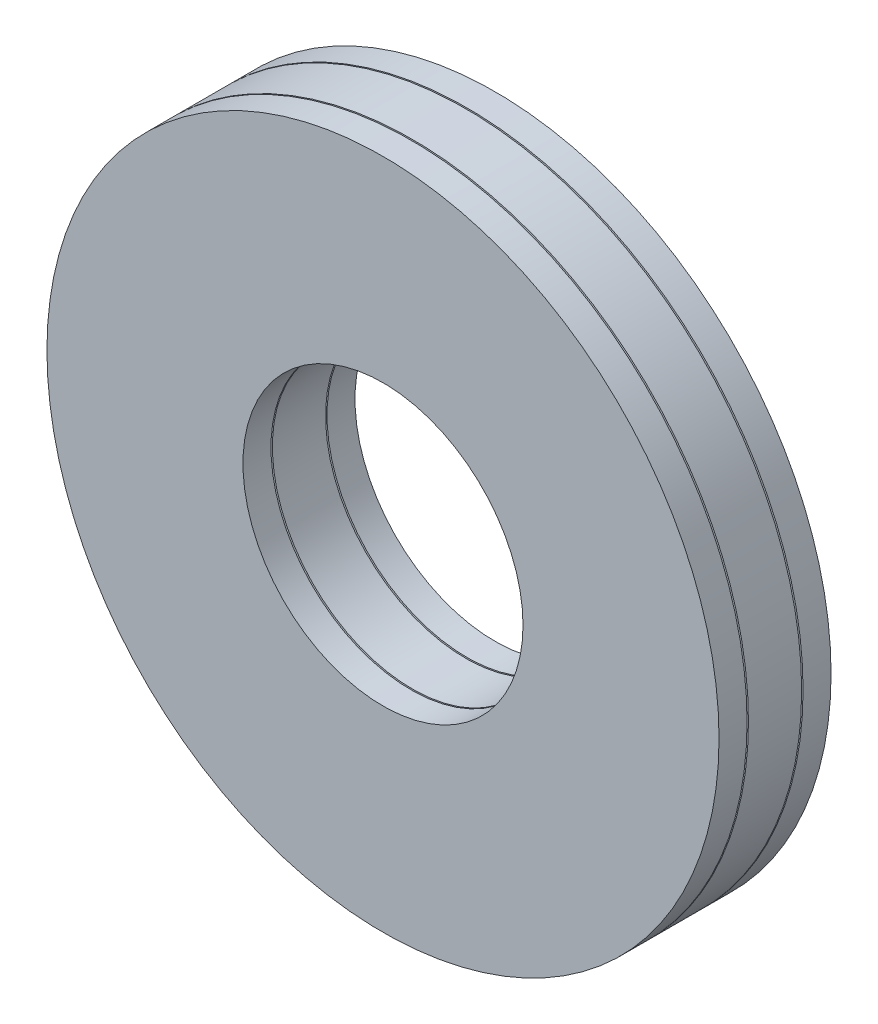
ISO-10303-21;
HEADER;
FILE_DESCRIPTION(('STEP AP214'),'2;1');
FILE_NAME('part.step','',(''),(''),'','','');
FILE_SCHEMA(('AUTOMOTIVE_DESIGN { 1 0 10303 214 1 1 1 1 }'));
ENDSEC;
DATA;
#1=APPLICATION_CONTEXT('core data for automotive mechanical design processes');
#2=APPLICATION_PROTOCOL_DEFINITION('international standard','automotive_design',2000,#1);
#3=PRODUCT_CONTEXT('',#1,'mechanical');
#4=PRODUCT('Part','Part','',(#3));
#5=PRODUCT_RELATED_PRODUCT_CATEGORY('part','',(#4));
#6=PRODUCT_DEFINITION_FORMATION('','',#4);
#7=PRODUCT_DEFINITION_CONTEXT('part definition',#1,'design');
#8=PRODUCT_DEFINITION('design','',#6,#7);
#9=PRODUCT_DEFINITION_SHAPE('','',#8);
#10=(LENGTH_UNIT() NAMED_UNIT(*) SI_UNIT(.MILLI.,.METRE.));
#11=(NAMED_UNIT(*) PLANE_ANGLE_UNIT() SI_UNIT($,.RADIAN.));
#12=(NAMED_UNIT(*) SI_UNIT($,.STERADIAN.) SOLID_ANGLE_UNIT());
#13=UNCERTAINTY_MEASURE_WITH_UNIT(LENGTH_MEASURE(1.E-05),#10,'distance_accuracy_value','');
#14=(GEOMETRIC_REPRESENTATION_CONTEXT(3) GLOBAL_UNCERTAINTY_ASSIGNED_CONTEXT((#13)) GLOBAL_UNIT_ASSIGNED_CONTEXT((#10,
#11,#12)) REPRESENTATION_CONTEXT('',''));
#15=CARTESIAN_POINT('',(0.,0.,0.));
#16=DIRECTION('',(0.,0.,1.));
#17=DIRECTION('',(1.,0.,0.));
#18=AXIS2_PLACEMENT_3D('',#15,#16,#17);
#19=CARTESIAN_POINT('',(0.,-12.,-0.99999999999999));
#20=DIRECTION('',(0.,0.,-1.));
#21=DIRECTION('',(-1.,0.,0.));
#22=AXIS2_PLACEMENT_3D('',#19,#20,#21);
#23=PLANE('',#22);
#24=CARTESIAN_POINT('',(0.,0.,-0.999999999999991));
#25=DIRECTION('',(0.,0.,1.));
#26=DIRECTION('',(1.,0.,0.));
#27=AXIS2_PLACEMENT_3D('',#24,#25,#26);
#28=CIRCLE('',#27,11.5);
#29=CARTESIAN_POINT('',(11.5,0.,-0.999999999999991));
#30=VERTEX_POINT('',#29);
#31=EDGE_CURVE('E10',#30,#30,#28,.T.);
#32=ORIENTED_EDGE('',*,*,#31,.F.);
#33=EDGE_LOOP('',(#32));
#34=FACE_BOUND('',#33,.T.);
#35=CARTESIAN_POINT('',(0.,0.,-0.999999999999989));
#36=DIRECTION('',(0.,0.,1.));
#37=DIRECTION('',(1.,0.,0.));
#38=AXIS2_PLACEMENT_3D('',#35,#36,#37);
#39=CIRCLE('',#38,12.);
#40=CARTESIAN_POINT('',(12.,0.,-0.999999999999989));
#41=VERTEX_POINT('',#40);
#42=EDGE_CURVE('E96',#41,#41,#39,.T.);
#43=ORIENTED_EDGE('',*,*,#42,.T.);
#44=EDGE_LOOP('',(#43));
#45=FACE_BOUND('',#44,.T.);
#46=ADVANCED_FACE('F32',(#34,#45),#23,.F.);
#47=CARTESIAN_POINT('',(0.,0.,1.99999999999999));
#48=DIRECTION('',(0.,0.,1.));
#49=DIRECTION('',(1.,0.,0.));
#50=AXIS2_PLACEMENT_3D('',#47,#48,#49);
#51=CYLINDRICAL_SURFACE('',#50,11.5);
#52=CARTESIAN_POINT('',(0.,0.,-0.94999999999999));
#53=DIRECTION('',(0.,0.,1.));
#54=DIRECTION('',(1.,0.,0.));
#55=AXIS2_PLACEMENT_3D('',#52,#53,#54);
#56=CIRCLE('',#55,11.5);
#57=CARTESIAN_POINT('',(11.5,0.,-0.94999999999999));
#58=VERTEX_POINT('',#57);
#59=EDGE_CURVE('E38',#58,#58,#56,.T.);
#60=ORIENTED_EDGE('',*,*,#59,.F.);
#61=EDGE_LOOP('',(#60));
#62=FACE_BOUND('',#61,.T.);
#63=ORIENTED_EDGE('',*,*,#31,.T.);
#64=EDGE_LOOP('',(#63));
#65=FACE_BOUND('',#64,.T.);
#66=ADVANCED_FACE('F205',(#62,#65),#51,.T.);
#67=CARTESIAN_POINT('',(0.,-12.,-0.94999999999999));
#68=DIRECTION('',(0.,0.,1.));
#69=DIRECTION('',(1.,0.,0.));
#70=AXIS2_PLACEMENT_3D('',#67,#68,#69);
#71=PLANE('',#70);
#72=CARTESIAN_POINT('',(0.,0.,-0.94999999999999));
#73=DIRECTION('',(0.,0.,1.));
#74=DIRECTION('',(1.,0.,0.));
#75=AXIS2_PLACEMENT_3D('',#72,#73,#74);
#76=CIRCLE('',#75,12.);
#77=CARTESIAN_POINT('',(12.,0.,-0.94999999999999));
#78=VERTEX_POINT('',#77);
#79=EDGE_CURVE('E42',#78,#78,#76,.T.);
#80=ORIENTED_EDGE('',*,*,#79,.F.);
#81=EDGE_LOOP('',(#80));
#82=FACE_BOUND('',#81,.T.);
#83=ORIENTED_EDGE('',*,*,#59,.T.);
#84=EDGE_LOOP('',(#83));
#85=FACE_BOUND('',#84,.T.);
#86=ADVANCED_FACE('F200',(#82,#85),#71,.F.);
#87=CARTESIAN_POINT('',(0.,0.,1.99999999999999));
#88=DIRECTION('',(0.,0.,1.));
#89=DIRECTION('',(1.,0.,0.));
#90=AXIS2_PLACEMENT_3D('',#87,#88,#89);
#91=CYLINDRICAL_SURFACE('',#90,12.);
#92=CARTESIAN_POINT('',(0.,0.,0.94999999999999));
#93=DIRECTION('',(0.,0.,1.));
#94=DIRECTION('',(1.,0.,0.));
#95=AXIS2_PLACEMENT_3D('',#92,#93,#94);
#96=CIRCLE('',#95,12.);
#97=CARTESIAN_POINT('',(12.,0.,0.94999999999999));
#98=VERTEX_POINT('',#97);
#99=EDGE_CURVE('E46',#98,#98,#96,.T.);
#100=ORIENTED_EDGE('',*,*,#99,.F.);
#101=EDGE_LOOP('',(#100));
#102=FACE_BOUND('',#101,.T.);
#103=ORIENTED_EDGE('',*,*,#79,.T.);
#104=EDGE_LOOP('',(#103));
#105=FACE_BOUND('',#104,.T.);
#106=ADVANCED_FACE('F194',(#102,#105),#91,.T.);
#107=CARTESIAN_POINT('',(0.,-12.,0.94999999999999));
#108=DIRECTION('',(0.,0.,-1.));
#109=DIRECTION('',(-1.,0.,0.));
#110=AXIS2_PLACEMENT_3D('',#107,#108,#109);
#111=PLANE('',#110);
#112=CARTESIAN_POINT('',(0.,0.,0.94999999999999));
#113=DIRECTION('',(0.,0.,1.));
#114=DIRECTION('',(1.,0.,0.));
#115=AXIS2_PLACEMENT_3D('',#112,#113,#114);
#116=CIRCLE('',#115,11.5);
#117=CARTESIAN_POINT('',(11.5,0.,0.94999999999999));
#118=VERTEX_POINT('',#117);
#119=EDGE_CURVE('E51',#118,#118,#116,.T.);
#120=ORIENTED_EDGE('',*,*,#119,.F.);
#121=EDGE_LOOP('',(#120));
#122=FACE_BOUND('',#121,.T.);
#123=ORIENTED_EDGE('',*,*,#99,.T.);
#124=EDGE_LOOP('',(#123));
#125=FACE_BOUND('',#124,.T.);
#126=ADVANCED_FACE('F188',(#122,#125),#111,.F.);
#127=CARTESIAN_POINT('',(0.,0.,1.99999999999999));
#128=DIRECTION('',(0.,0.,1.));
#129=DIRECTION('',(1.,0.,0.));
#130=AXIS2_PLACEMENT_3D('',#127,#128,#129);
#131=CYLINDRICAL_SURFACE('',#130,11.5);
#132=CARTESIAN_POINT('',(0.,0.,0.999999999999991));
#133=DIRECTION('',(0.,0.,1.));
#134=DIRECTION('',(1.,0.,0.));
#135=AXIS2_PLACEMENT_3D('',#132,#133,#134);
#136=CIRCLE('',#135,11.5);
#137=CARTESIAN_POINT('',(11.5,0.,0.999999999999991));
#138=VERTEX_POINT('',#137);
#139=EDGE_CURVE('E54',#138,#138,#136,.T.);
#140=ORIENTED_EDGE('',*,*,#139,.F.);
#141=EDGE_LOOP('',(#140));
#142=FACE_BOUND('',#141,.T.);
#143=ORIENTED_EDGE('',*,*,#119,.T.);
#144=EDGE_LOOP('',(#143));
#145=FACE_BOUND('',#144,.T.);
#146=ADVANCED_FACE('F182',(#142,#145),#131,.T.);
#147=CARTESIAN_POINT('',(0.,-12.,0.99999999999999));
#148=DIRECTION('',(0.,0.,1.));
#149=DIRECTION('',(1.,0.,0.));
#150=AXIS2_PLACEMENT_3D('',#147,#148,#149);
#151=PLANE('',#150);
#152=CARTESIAN_POINT('',(0.,0.,0.999999999999989));
#153=DIRECTION('',(0.,0.,1.));
#154=DIRECTION('',(1.,0.,0.));
#155=AXIS2_PLACEMENT_3D('',#152,#153,#154);
#156=CIRCLE('',#155,12.);
#157=CARTESIAN_POINT('',(12.,0.,0.999999999999989));
#158=VERTEX_POINT('',#157);
#159=EDGE_CURVE('E57',#158,#158,#156,.T.);
#160=ORIENTED_EDGE('',*,*,#159,.F.);
#161=EDGE_LOOP('',(#160));
#162=FACE_BOUND('',#161,.T.);
#163=ORIENTED_EDGE('',*,*,#139,.T.);
#164=EDGE_LOOP('',(#163));
#165=FACE_BOUND('',#164,.T.);
#166=ADVANCED_FACE('F176',(#162,#165),#151,.F.);
#167=CARTESIAN_POINT('',(0.,0.,1.99999999999999));
#168=DIRECTION('',(0.,0.,1.));
#169=DIRECTION('',(1.,0.,0.));
#170=AXIS2_PLACEMENT_3D('',#167,#168,#169);
#171=CYLINDRICAL_SURFACE('',#170,12.);
#172=CARTESIAN_POINT('',(0.,0.,1.99999999999999));
#173=DIRECTION('',(0.,0.,1.));
#174=DIRECTION('',(1.,0.,0.));
#175=AXIS2_PLACEMENT_3D('',#172,#173,#174);
#176=CIRCLE('',#175,12.);
#177=CARTESIAN_POINT('',(12.,0.,1.99999999999999));
#178=VERTEX_POINT('',#177);
#179=EDGE_CURVE('E60',#178,#178,#176,.T.);
#180=ORIENTED_EDGE('',*,*,#179,.F.);
#181=EDGE_LOOP('',(#180));
#182=FACE_BOUND('',#181,.T.);
#183=ORIENTED_EDGE('',*,*,#159,.T.);
#184=EDGE_LOOP('',(#183));
#185=FACE_BOUND('',#184,.T.);
#186=ADVANCED_FACE('F170',(#182,#185),#171,.T.);
#187=CARTESIAN_POINT('',(0.,-12.,1.99999999999999));
#188=DIRECTION('',(0.,0.,-1.));
#189=DIRECTION('',(-1.,0.,0.));
#190=AXIS2_PLACEMENT_3D('',#187,#188,#189);
#191=PLANE('',#190);
#192=CARTESIAN_POINT('',(0.,0.,1.99999999999999));
#193=DIRECTION('',(0.,0.,1.));
#194=DIRECTION('',(1.,0.,0.));
#195=AXIS2_PLACEMENT_3D('',#192,#193,#194);
#196=CIRCLE('',#195,5.);
#197=CARTESIAN_POINT('',(5.,0.,1.99999999999999));
#198=VERTEX_POINT('',#197);
#199=EDGE_CURVE('E63',#198,#198,#196,.T.);
#200=ORIENTED_EDGE('',*,*,#199,.F.);
#201=EDGE_LOOP('',(#200));
#202=FACE_BOUND('',#201,.T.);
#203=ORIENTED_EDGE('',*,*,#179,.T.);
#204=EDGE_LOOP('',(#203));
#205=FACE_BOUND('',#204,.T.);
#206=ADVANCED_FACE('F164',(#202,#205),#191,.F.);
#207=CARTESIAN_POINT('',(0.,0.,1.99999999999999));
#208=DIRECTION('',(0.,0.,1.));
#209=DIRECTION('',(1.,0.,0.));
#210=AXIS2_PLACEMENT_3D('',#207,#208,#209);
#211=CYLINDRICAL_SURFACE('',#210,5.);
#212=CARTESIAN_POINT('',(0.,0.,0.999999999999988));
#213=DIRECTION('',(0.,0.,1.));
#214=DIRECTION('',(1.,0.,0.));
#215=AXIS2_PLACEMENT_3D('',#212,#213,#214);
#216=CIRCLE('',#215,5.);
#217=CARTESIAN_POINT('',(5.,0.,0.999999999999988));
#218=VERTEX_POINT('',#217);
#219=EDGE_CURVE('E66',#218,#218,#216,.T.);
#220=ORIENTED_EDGE('',*,*,#219,.F.);
#221=EDGE_LOOP('',(#220));
#222=FACE_BOUND('',#221,.T.);
#223=ORIENTED_EDGE('',*,*,#199,.T.);
#224=EDGE_LOOP('',(#223));
#225=FACE_BOUND('',#224,.T.);
#226=ADVANCED_FACE('F158',(#222,#225),#211,.F.);
#227=CARTESIAN_POINT('',(0.,-6.,0.999999999999989));
#228=DIRECTION('',(0.,0.,1.));
#229=DIRECTION('',(1.,0.,0.));
#230=AXIS2_PLACEMENT_3D('',#227,#228,#229);
#231=PLANE('',#230);
#232=CARTESIAN_POINT('',(0.,0.,0.99999999999999));
#233=DIRECTION('',(0.,0.,1.));
#234=DIRECTION('',(1.,0.,0.));
#235=AXIS2_PLACEMENT_3D('',#232,#233,#234);
#236=CIRCLE('',#235,6.);
#237=CARTESIAN_POINT('',(6.,0.,0.99999999999999));
#238=VERTEX_POINT('',#237);
#239=EDGE_CURVE('E69',#238,#238,#236,.T.);
#240=ORIENTED_EDGE('',*,*,#239,.F.);
#241=EDGE_LOOP('',(#240));
#242=FACE_BOUND('',#241,.T.);
#243=ORIENTED_EDGE('',*,*,#219,.T.);
#244=EDGE_LOOP('',(#243));
#245=FACE_BOUND('',#244,.T.);
#246=ADVANCED_FACE('F152',(#242,#245),#231,.F.);
#247=CARTESIAN_POINT('',(0.,0.,1.99999999999999));
#248=DIRECTION('',(0.,0.,1.));
#249=DIRECTION('',(1.,0.,0.));
#250=AXIS2_PLACEMENT_3D('',#247,#248,#249);
#251=CYLINDRICAL_SURFACE('',#250,6.);
#252=CARTESIAN_POINT('',(0.,0.,0.949999999999989));
#253=DIRECTION('',(0.,0.,1.));
#254=DIRECTION('',(1.,0.,0.));
#255=AXIS2_PLACEMENT_3D('',#252,#253,#254);
#256=CIRCLE('',#255,6.);
#257=CARTESIAN_POINT('',(6.,0.,0.949999999999989));
#258=VERTEX_POINT('',#257);
#259=EDGE_CURVE('E72',#258,#258,#256,.T.);
#260=ORIENTED_EDGE('',*,*,#259,.F.);
#261=EDGE_LOOP('',(#260));
#262=FACE_BOUND('',#261,.T.);
#263=ORIENTED_EDGE('',*,*,#239,.T.);
#264=EDGE_LOOP('',(#263));
#265=FACE_BOUND('',#264,.T.);
#266=ADVANCED_FACE('F146',(#262,#265),#251,.F.);
#267=CARTESIAN_POINT('',(0.,-6.,0.949999999999989));
#268=DIRECTION('',(0.,0.,-1.));
#269=DIRECTION('',(-1.,0.,0.));
#270=AXIS2_PLACEMENT_3D('',#267,#268,#269);
#271=PLANE('',#270);
#272=CARTESIAN_POINT('',(0.,0.,0.949999999999989));
#273=DIRECTION('',(0.,0.,1.));
#274=DIRECTION('',(1.,0.,0.));
#275=AXIS2_PLACEMENT_3D('',#272,#273,#274);
#276=CIRCLE('',#275,5.);
#277=CARTESIAN_POINT('',(5.,0.,0.949999999999989));
#278=VERTEX_POINT('',#277);
#279=EDGE_CURVE('E75',#278,#278,#276,.T.);
#280=ORIENTED_EDGE('',*,*,#279,.F.);
#281=EDGE_LOOP('',(#280));
#282=FACE_BOUND('',#281,.T.);
#283=ORIENTED_EDGE('',*,*,#259,.T.);
#284=EDGE_LOOP('',(#283));
#285=FACE_BOUND('',#284,.T.);
#286=ADVANCED_FACE('F140',(#282,#285),#271,.F.);
#287=CARTESIAN_POINT('',(0.,0.,1.99999999999999));
#288=DIRECTION('',(0.,0.,1.));
#289=DIRECTION('',(1.,0.,0.));
#290=AXIS2_PLACEMENT_3D('',#287,#288,#289);
#291=CYLINDRICAL_SURFACE('',#290,5.);
#292=CARTESIAN_POINT('',(0.,0.,-0.949999999999991));
#293=DIRECTION('',(0.,0.,1.));
#294=DIRECTION('',(1.,0.,0.));
#295=AXIS2_PLACEMENT_3D('',#292,#293,#294);
#296=CIRCLE('',#295,5.);
#297=CARTESIAN_POINT('',(5.,0.,-0.949999999999991));
#298=VERTEX_POINT('',#297);
#299=EDGE_CURVE('E78',#298,#298,#296,.T.);
#300=ORIENTED_EDGE('',*,*,#299,.F.);
#301=EDGE_LOOP('',(#300));
#302=FACE_BOUND('',#301,.T.);
#303=ORIENTED_EDGE('',*,*,#279,.T.);
#304=EDGE_LOOP('',(#303));
#305=FACE_BOUND('',#304,.T.);
#306=ADVANCED_FACE('F134',(#302,#305),#291,.F.);
#307=CARTESIAN_POINT('',(0.,-6.,-0.949999999999991));
#308=DIRECTION('',(0.,0.,1.));
#309=DIRECTION('',(1.,0.,0.));
#310=AXIS2_PLACEMENT_3D('',#307,#308,#309);
#311=PLANE('',#310);
#312=CARTESIAN_POINT('',(0.,0.,-0.949999999999991));
#313=DIRECTION('',(0.,0.,1.));
#314=DIRECTION('',(1.,0.,0.));
#315=AXIS2_PLACEMENT_3D('',#312,#313,#314);
#316=CIRCLE('',#315,6.);
#317=CARTESIAN_POINT('',(6.,0.,-0.949999999999991));
#318=VERTEX_POINT('',#317);
#319=EDGE_CURVE('E81',#318,#318,#316,.T.);
#320=ORIENTED_EDGE('',*,*,#319,.F.);
#321=EDGE_LOOP('',(#320));
#322=FACE_BOUND('',#321,.T.);
#323=ORIENTED_EDGE('',*,*,#299,.T.);
#324=EDGE_LOOP('',(#323));
#325=FACE_BOUND('',#324,.T.);
#326=ADVANCED_FACE('F128',(#322,#325),#311,.F.);
#327=CARTESIAN_POINT('',(0.,0.,1.99999999999999));
#328=DIRECTION('',(0.,0.,1.));
#329=DIRECTION('',(1.,0.,0.));
#330=AXIS2_PLACEMENT_3D('',#327,#328,#329);
#331=CYLINDRICAL_SURFACE('',#330,6.);
#332=CARTESIAN_POINT('',(0.,0.,-0.999999999999992));
#333=DIRECTION('',(0.,0.,1.));
#334=DIRECTION('',(1.,0.,0.));
#335=AXIS2_PLACEMENT_3D('',#332,#333,#334);
#336=CIRCLE('',#335,6.);
#337=CARTESIAN_POINT('',(6.,0.,-0.999999999999992));
#338=VERTEX_POINT('',#337);
#339=EDGE_CURVE('E84',#338,#338,#336,.T.);
#340=ORIENTED_EDGE('',*,*,#339,.F.);
#341=EDGE_LOOP('',(#340));
#342=FACE_BOUND('',#341,.T.);
#343=ORIENTED_EDGE('',*,*,#319,.T.);
#344=EDGE_LOOP('',(#343));
#345=FACE_BOUND('',#344,.T.);
#346=ADVANCED_FACE('F122',(#342,#345),#331,.F.);
#347=CARTESIAN_POINT('',(0.,-6.,-0.99999999999999));
#348=DIRECTION('',(0.,0.,-1.));
#349=DIRECTION('',(-1.,0.,0.));
#350=AXIS2_PLACEMENT_3D('',#347,#348,#349);
#351=PLANE('',#350);
#352=CARTESIAN_POINT('',(0.,0.,-0.99999999999999));
#353=DIRECTION('',(0.,0.,1.));
#354=DIRECTION('',(1.,0.,0.));
#355=AXIS2_PLACEMENT_3D('',#352,#353,#354);
#356=CIRCLE('',#355,5.);
#357=CARTESIAN_POINT('',(5.,0.,-0.99999999999999));
#358=VERTEX_POINT('',#357);
#359=EDGE_CURVE('E87',#358,#358,#356,.T.);
#360=ORIENTED_EDGE('',*,*,#359,.F.);
#361=EDGE_LOOP('',(#360));
#362=FACE_BOUND('',#361,.T.);
#363=ORIENTED_EDGE('',*,*,#339,.T.);
#364=EDGE_LOOP('',(#363));
#365=FACE_BOUND('',#364,.T.);
#366=ADVANCED_FACE('F116',(#362,#365),#351,.F.);
#367=CARTESIAN_POINT('',(0.,0.,1.99999999999999));
#368=DIRECTION('',(0.,0.,1.));
#369=DIRECTION('',(1.,0.,0.));
#370=AXIS2_PLACEMENT_3D('',#367,#368,#369);
#371=CYLINDRICAL_SURFACE('',#370,5.);
#372=CARTESIAN_POINT('',(0.,0.,-1.99999999999999));
#373=DIRECTION('',(0.,0.,1.));
#374=DIRECTION('',(1.,0.,0.));
#375=AXIS2_PLACEMENT_3D('',#372,#373,#374);
#376=CIRCLE('',#375,5.);
#377=CARTESIAN_POINT('',(5.,0.,-1.99999999999999));
#378=VERTEX_POINT('',#377);
#379=EDGE_CURVE('E90',#378,#378,#376,.T.);
#380=ORIENTED_EDGE('',*,*,#379,.F.);
#381=EDGE_LOOP('',(#380));
#382=FACE_BOUND('',#381,.T.);
#383=ORIENTED_EDGE('',*,*,#359,.T.);
#384=EDGE_LOOP('',(#383));
#385=FACE_BOUND('',#384,.T.);
#386=ADVANCED_FACE('F110',(#382,#385),#371,.F.);
#387=CARTESIAN_POINT('',(0.,-12.,-1.99999999999999));
#388=DIRECTION('',(0.,0.,1.));
#389=DIRECTION('',(1.,0.,0.));
#390=AXIS2_PLACEMENT_3D('',#387,#388,#389);
#391=PLANE('',#390);
#392=CARTESIAN_POINT('',(0.,0.,-1.99999999999999));
#393=DIRECTION('',(0.,0.,1.));
#394=DIRECTION('',(1.,0.,0.));
#395=AXIS2_PLACEMENT_3D('',#392,#393,#394);
#396=CIRCLE('',#395,12.);
#397=CARTESIAN_POINT('',(12.,0.,-1.99999999999999));
#398=VERTEX_POINT('',#397);
#399=EDGE_CURVE('E93',#398,#398,#396,.T.);
#400=ORIENTED_EDGE('',*,*,#399,.F.);
#401=EDGE_LOOP('',(#400));
#402=FACE_BOUND('',#401,.T.);
#403=ORIENTED_EDGE('',*,*,#379,.T.);
#404=EDGE_LOOP('',(#403));
#405=FACE_BOUND('',#404,.T.);
#406=ADVANCED_FACE('F104',(#402,#405),#391,.F.);
#407=CARTESIAN_POINT('',(0.,0.,1.99999999999999));
#408=DIRECTION('',(0.,0.,1.));
#409=DIRECTION('',(1.,0.,0.));
#410=AXIS2_PLACEMENT_3D('',#407,#408,#409);
#411=CYLINDRICAL_SURFACE('',#410,12.);
#412=ORIENTED_EDGE('',*,*,#42,.F.);
#413=EDGE_LOOP('',(#412));
#414=FACE_BOUND('',#413,.T.);
#415=ORIENTED_EDGE('',*,*,#399,.T.);
#416=EDGE_LOOP('',(#415));
#417=FACE_BOUND('',#416,.T.);
#418=ADVANCED_FACE('F101',(#414,#417),#411,.T.);
#419=CLOSED_SHELL('',(#46,#66,#86,#106,#126,#146,#166,#186,#206,#226,#246,#266,#286,#306,#326,
#346,#366,#386,#406,#418));
#420=MANIFOLD_SOLID_BREP('B2',#419);
#421=ADVANCED_BREP_SHAPE_REPRESENTATION('',(#18,#420),#14);
#422=SHAPE_DEFINITION_REPRESENTATION(#9,#421);
ENDSEC;
END-ISO-10303-21;
